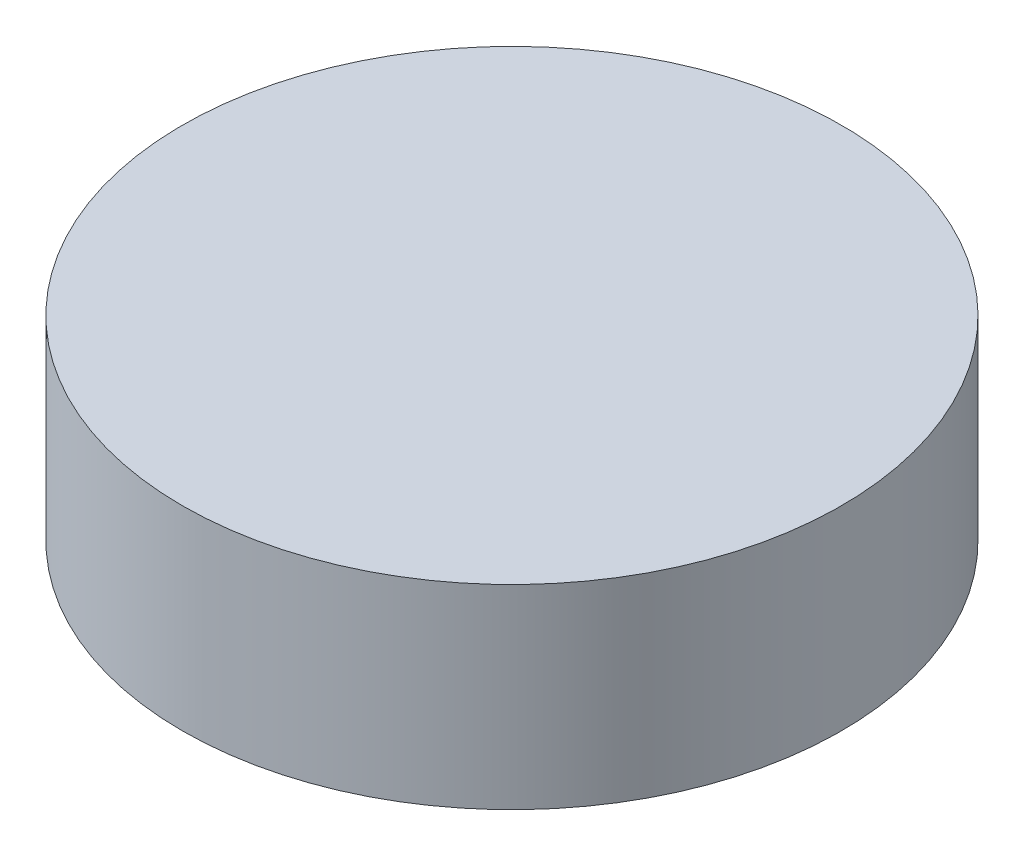
ISO-10303-21;
HEADER;
FILE_DESCRIPTION(('STEP AP214'),'2;1');
FILE_NAME('part.step','',(''),(''),'','','');
FILE_SCHEMA(('AUTOMOTIVE_DESIGN { 1 0 10303 214 1 1 1 1 }'));
ENDSEC;
DATA;
#1=APPLICATION_CONTEXT('core data for automotive mechanical design processes');
#2=APPLICATION_PROTOCOL_DEFINITION('international standard','automotive_design',2000,#1);
#3=PRODUCT_CONTEXT('',#1,'mechanical');
#4=PRODUCT('Part','Part','',(#3));
#5=PRODUCT_RELATED_PRODUCT_CATEGORY('part','',(#4));
#6=PRODUCT_DEFINITION_FORMATION('','',#4);
#7=PRODUCT_DEFINITION_CONTEXT('part definition',#1,'design');
#8=PRODUCT_DEFINITION('design','',#6,#7);
#9=PRODUCT_DEFINITION_SHAPE('','',#8);
#10=(LENGTH_UNIT() NAMED_UNIT(*) SI_UNIT(.MILLI.,.METRE.));
#11=(NAMED_UNIT(*) PLANE_ANGLE_UNIT() SI_UNIT($,.RADIAN.));
#12=(NAMED_UNIT(*) SI_UNIT($,.STERADIAN.) SOLID_ANGLE_UNIT());
#13=UNCERTAINTY_MEASURE_WITH_UNIT(LENGTH_MEASURE(1.E-05),#10,'distance_accuracy_value','');
#14=(GEOMETRIC_REPRESENTATION_CONTEXT(3) GLOBAL_UNCERTAINTY_ASSIGNED_CONTEXT((#13)) GLOBAL_UNIT_ASSIGNED_CONTEXT((#10,
#11,#12)) REPRESENTATION_CONTEXT('',''));
#15=CARTESIAN_POINT('',(0.,0.,0.));
#16=DIRECTION('',(0.,0.,1.));
#17=DIRECTION('',(1.,0.,0.));
#18=AXIS2_PLACEMENT_3D('',#15,#16,#17);
#19=CARTESIAN_POINT('',(0.,1420.,0.));
#20=DIRECTION('',(0.,-1.,0.));
#21=DIRECTION('',(0.,0.,-1.));
#22=AXIS2_PLACEMENT_3D('',#19,#20,#21);
#23=CYLINDRICAL_SURFACE('',#22,2400.);
#24=CARTESIAN_POINT('',(0.,1420.,0.));
#25=DIRECTION('',(0.,1.,0.));
#26=DIRECTION('',(0.,0.,1.));
#27=AXIS2_PLACEMENT_3D('',#24,#25,#26);
#28=CIRCLE('',#27,2400.);
#29=CARTESIAN_POINT('',(0.,1420.,2400.));
#30=VERTEX_POINT('',#29);
#31=EDGE_CURVE('E11',#30,#30,#28,.T.);
#32=ORIENTED_EDGE('',*,*,#31,.F.);
#33=EDGE_LOOP('',(#32));
#34=FACE_BOUND('',#33,.T.);
#35=CARTESIAN_POINT('',(0.,0.,0.));
#36=DIRECTION('',(0.,1.,0.));
#37=DIRECTION('',(0.,0.,1.));
#38=AXIS2_PLACEMENT_3D('',#35,#36,#37);
#39=CIRCLE('',#38,2400.);
#40=CARTESIAN_POINT('',(0.,0.,2400.));
#41=VERTEX_POINT('',#40);
#42=EDGE_CURVE('E44',#41,#41,#39,.T.);
#43=ORIENTED_EDGE('',*,*,#42,.T.);
#44=EDGE_LOOP('',(#43));
#45=FACE_BOUND('',#44,.T.);
#46=ADVANCED_FACE('F40',(#34,#45),#23,.T.);
#47=CARTESIAN_POINT('',(0.,1420.,0.));
#48=DIRECTION('',(0.,1.,0.));
#49=DIRECTION('',(0.,0.,1.));
#50=AXIS2_PLACEMENT_3D('',#47,#48,#49);
#51=PLANE('',#50);
#52=ORIENTED_EDGE('',*,*,#31,.T.);
#53=EDGE_LOOP('',(#52));
#54=FACE_BOUND('',#53,.T.);
#55=ADVANCED_FACE('F60',(#54),#51,.T.);
#56=CARTESIAN_POINT('',(0.,0.,0.));
#57=DIRECTION('',(0.,1.,0.));
#58=DIRECTION('',(0.,0.,1.));
#59=AXIS2_PLACEMENT_3D('',#56,#57,#58);
#60=PLANE('',#59);
#61=ORIENTED_EDGE('',*,*,#42,.F.);
#62=EDGE_LOOP('',(#61));
#63=FACE_BOUND('',#62,.T.);
#64=ADVANCED_FACE('F58',(#63),#60,.F.);
#65=CLOSED_SHELL('',(#46,#55,#64));
#66=MANIFOLD_SOLID_BREP('B2',#65);
#67=ADVANCED_BREP_SHAPE_REPRESENTATION('',(#18,#66),#14);
#68=SHAPE_DEFINITION_REPRESENTATION(#9,#67);
ENDSEC;
END-ISO-10303-21;
